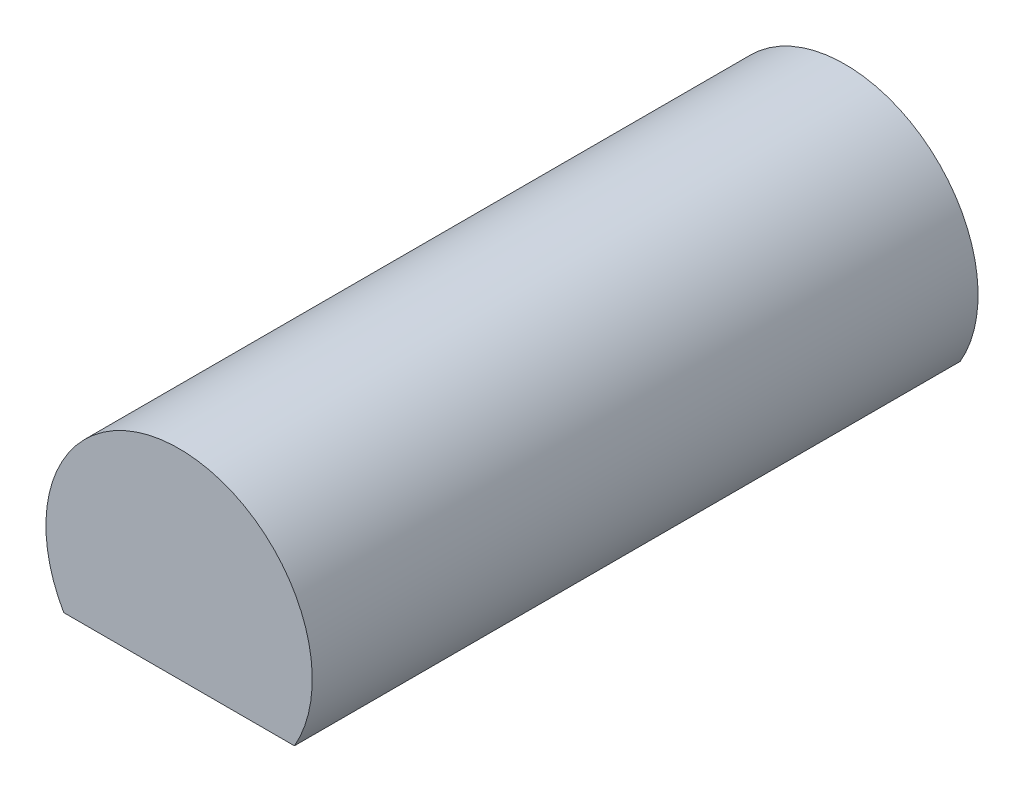
ISO-10303-21;
HEADER;
FILE_DESCRIPTION(('STEP AP214'),'2;1');
FILE_NAME('part.step','',(''),(''),'','','');
FILE_SCHEMA(('AUTOMOTIVE_DESIGN { 1 0 10303 214 1 1 1 1 }'));
ENDSEC;
DATA;
#1=APPLICATION_CONTEXT('core data for automotive mechanical design processes');
#2=APPLICATION_PROTOCOL_DEFINITION('international standard','automotive_design',2000,#1);
#3=PRODUCT_CONTEXT('',#1,'mechanical');
#4=PRODUCT('Part','Part','',(#3));
#5=PRODUCT_RELATED_PRODUCT_CATEGORY('part','',(#4));
#6=PRODUCT_DEFINITION_FORMATION('','',#4);
#7=PRODUCT_DEFINITION_CONTEXT('part definition',#1,'design');
#8=PRODUCT_DEFINITION('design','',#6,#7);
#9=PRODUCT_DEFINITION_SHAPE('','',#8);
#10=(LENGTH_UNIT() NAMED_UNIT(*) SI_UNIT(.MILLI.,.METRE.));
#11=(NAMED_UNIT(*) PLANE_ANGLE_UNIT() SI_UNIT($,.RADIAN.));
#12=(NAMED_UNIT(*) SI_UNIT($,.STERADIAN.) SOLID_ANGLE_UNIT());
#13=UNCERTAINTY_MEASURE_WITH_UNIT(LENGTH_MEASURE(1.E-05),#10,'distance_accuracy_value','');
#14=(GEOMETRIC_REPRESENTATION_CONTEXT(3) GLOBAL_UNCERTAINTY_ASSIGNED_CONTEXT((#13)) GLOBAL_UNIT_ASSIGNED_CONTEXT((#10,
#11,#12)) REPRESENTATION_CONTEXT('',''));
#15=CARTESIAN_POINT('',(0.,0.,0.));
#16=DIRECTION('',(0.,0.,1.));
#17=DIRECTION('',(1.,0.,0.));
#18=AXIS2_PLACEMENT_3D('',#15,#16,#17);
#19=CARTESIAN_POINT('',(0.,-1.,10.));
#20=DIRECTION('',(0.,1.,0.));
#21=DIRECTION('',(0.,0.,1.));
#22=AXIS2_PLACEMENT_3D('',#19,#20,#21);
#23=PLANE('',#22);
#24=DIRECTION('',(1.,0.,0.));
#25=VECTOR('',#24,1.);
#26=CARTESIAN_POINT('',(0.,-1.,0.));
#27=LINE('',#26,#25);
#28=CARTESIAN_POINT('',(-1.73205080756888,-1.,0.));
#29=VERTEX_POINT('',#28);
#30=CARTESIAN_POINT('',(1.73205080756888,-1.,0.));
#31=VERTEX_POINT('',#30);
#32=EDGE_CURVE('E70',#29,#31,#27,.T.);
#33=ORIENTED_EDGE('',*,*,#32,.T.);
#34=DIRECTION('',(0.,0.,-1.));
#35=VECTOR('',#34,1.);
#36=CARTESIAN_POINT('',(1.73205080756888,-1.,10.));
#37=LINE('',#36,#35);
#38=CARTESIAN_POINT('',(1.73205080756888,-1.,10.));
#39=VERTEX_POINT('',#38);
#40=EDGE_CURVE('E11',#39,#31,#37,.T.);
#41=ORIENTED_EDGE('',*,*,#40,.F.);
#42=DIRECTION('',(1.,0.,0.));
#43=VECTOR('',#42,1.);
#44=CARTESIAN_POINT('',(0.,-1.,10.));
#45=LINE('',#44,#43);
#46=CARTESIAN_POINT('',(-1.73205080756888,-1.,10.));
#47=VERTEX_POINT('',#46);
#48=EDGE_CURVE('E69',#47,#39,#45,.T.);
#49=ORIENTED_EDGE('',*,*,#48,.F.);
#50=DIRECTION('',(0.,0.,-1.));
#51=VECTOR('',#50,1.);
#52=CARTESIAN_POINT('',(-1.73205080756888,-1.,10.));
#53=LINE('',#52,#51);
#54=EDGE_CURVE('E47',#47,#29,#53,.T.);
#55=ORIENTED_EDGE('',*,*,#54,.T.);
#56=EDGE_LOOP('',(#33,#41,#49,#55));
#57=FACE_BOUND('',#56,.T.);
#58=ADVANCED_FACE('F39',(#57),#23,.F.);
#59=CARTESIAN_POINT('',(0.,0.,10.));
#60=DIRECTION('',(0.,0.,-1.));
#61=DIRECTION('',(-1.,0.,0.));
#62=AXIS2_PLACEMENT_3D('',#59,#60,#61);
#63=CYLINDRICAL_SURFACE('',#62,2.);
#64=CARTESIAN_POINT('',(0.,0.,0.));
#65=DIRECTION('',(0.,0.,1.));
#66=DIRECTION('',(1.,0.,0.));
#67=AXIS2_PLACEMENT_3D('',#64,#65,#66);
#68=CIRCLE('',#67,2.);
#69=EDGE_CURVE('E62',#31,#29,#68,.T.);
#70=ORIENTED_EDGE('',*,*,#69,.T.);
#71=ORIENTED_EDGE('',*,*,#54,.F.);
#72=CARTESIAN_POINT('',(0.,0.,10.));
#73=DIRECTION('',(0.,0.,1.));
#74=DIRECTION('',(1.,0.,0.));
#75=AXIS2_PLACEMENT_3D('',#72,#73,#74);
#76=CIRCLE('',#75,2.);
#77=EDGE_CURVE('E54',#39,#47,#76,.T.);
#78=ORIENTED_EDGE('',*,*,#77,.F.);
#79=ORIENTED_EDGE('',*,*,#40,.T.);
#80=EDGE_LOOP('',(#70,#71,#78,#79));
#81=FACE_BOUND('',#80,.T.);
#82=ADVANCED_FACE('F65',(#81),#63,.T.);
#83=CARTESIAN_POINT('',(0.,0.,10.));
#84=DIRECTION('',(0.,0.,1.));
#85=DIRECTION('',(1.,0.,0.));
#86=AXIS2_PLACEMENT_3D('',#83,#84,#85);
#87=PLANE('',#86);
#88=ORIENTED_EDGE('',*,*,#48,.T.);
#89=ORIENTED_EDGE('',*,*,#77,.T.);
#90=EDGE_LOOP('',(#88,#89));
#91=FACE_BOUND('',#90,.T.);
#92=ADVANCED_FACE('F77',(#91),#87,.T.);
#93=CARTESIAN_POINT('',(0.,0.,0.));
#94=DIRECTION('',(0.,0.,1.));
#95=DIRECTION('',(1.,0.,0.));
#96=AXIS2_PLACEMENT_3D('',#93,#94,#95);
#97=PLANE('',#96);
#98=ORIENTED_EDGE('',*,*,#32,.F.);
#99=ORIENTED_EDGE('',*,*,#69,.F.);
#100=EDGE_LOOP('',(#98,#99));
#101=FACE_BOUND('',#100,.T.);
#102=ADVANCED_FACE('F73',(#101),#97,.F.);
#103=CLOSED_SHELL('',(#58,#82,#92,#102));
#104=MANIFOLD_SOLID_BREP('B2',#103);
#105=ADVANCED_BREP_SHAPE_REPRESENTATION('',(#18,#104),#14);
#106=SHAPE_DEFINITION_REPRESENTATION(#9,#105);
ENDSEC;
END-ISO-10303-21;
